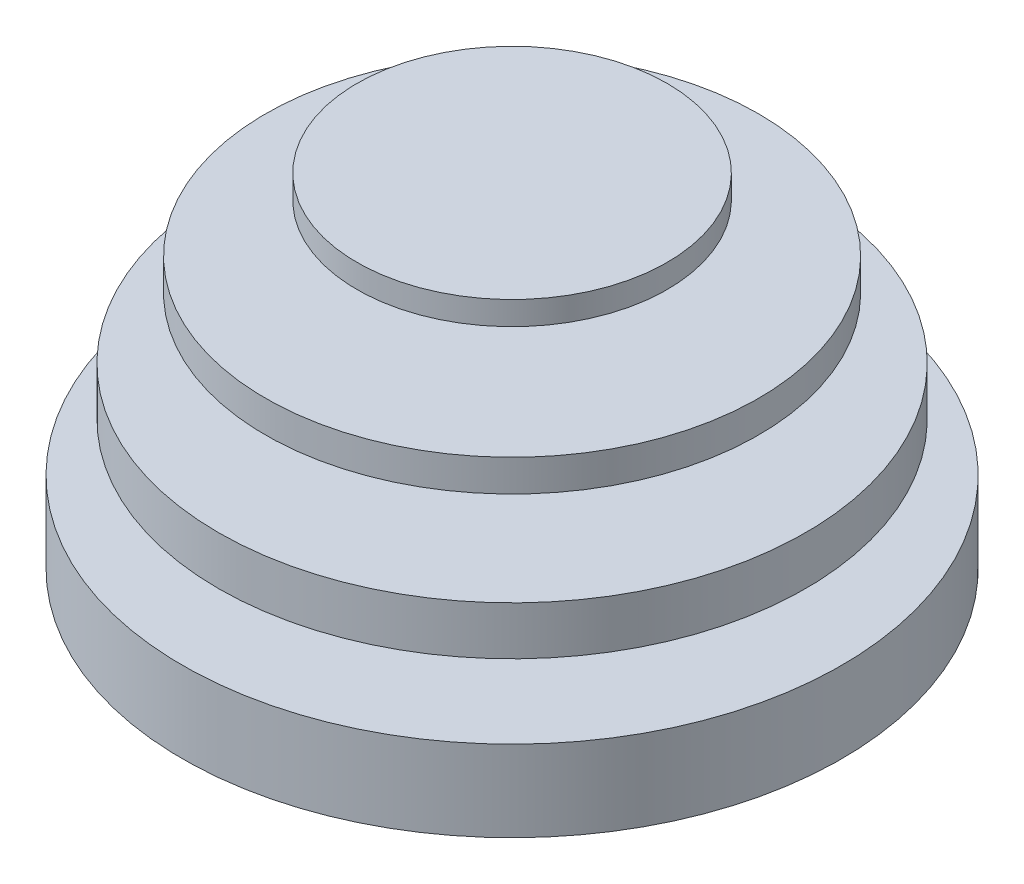
ISO-10303-21;
HEADER;
FILE_DESCRIPTION(('STEP AP214'),'2;1');
FILE_NAME('part.step','',(''),(''),'','','');
FILE_SCHEMA(('AUTOMOTIVE_DESIGN { 1 0 10303 214 1 1 1 1 }'));
ENDSEC;
DATA;
#1=APPLICATION_CONTEXT('core data for automotive mechanical design processes');
#2=APPLICATION_PROTOCOL_DEFINITION('international standard','automotive_design',2000,#1);
#3=PRODUCT_CONTEXT('',#1,'mechanical');
#4=PRODUCT('Part','Part','',(#3));
#5=PRODUCT_RELATED_PRODUCT_CATEGORY('part','',(#4));
#6=PRODUCT_DEFINITION_FORMATION('','',#4);
#7=PRODUCT_DEFINITION_CONTEXT('part definition',#1,'design');
#8=PRODUCT_DEFINITION('design','',#6,#7);
#9=PRODUCT_DEFINITION_SHAPE('','',#8);
#10=(LENGTH_UNIT() NAMED_UNIT(*) SI_UNIT(.MILLI.,.METRE.));
#11=(NAMED_UNIT(*) PLANE_ANGLE_UNIT() SI_UNIT($,.RADIAN.));
#12=(NAMED_UNIT(*) SI_UNIT($,.STERADIAN.) SOLID_ANGLE_UNIT());
#13=UNCERTAINTY_MEASURE_WITH_UNIT(LENGTH_MEASURE(1.E-05),#10,'distance_accuracy_value','');
#14=(GEOMETRIC_REPRESENTATION_CONTEXT(3) GLOBAL_UNCERTAINTY_ASSIGNED_CONTEXT((#13)) GLOBAL_UNIT_ASSIGNED_CONTEXT((#10,
#11,#12)) REPRESENTATION_CONTEXT('',''));
#15=CARTESIAN_POINT('',(0.,0.,0.));
#16=DIRECTION('',(0.,0.,1.));
#17=DIRECTION('',(1.,0.,0.));
#18=AXIS2_PLACEMENT_3D('',#15,#16,#17);
#19=CARTESIAN_POINT('',(0.,67.0732075041318,0.));
#20=DIRECTION('',(0.,1.,0.));
#21=DIRECTION('',(0.,0.,1.));
#22=AXIS2_PLACEMENT_3D('',#19,#20,#21);
#23=PLANE('',#22);
#24=CARTESIAN_POINT('',(0.,67.0732075041318,0.));
#25=DIRECTION('',(0.,-1.,0.));
#26=DIRECTION('',(0.,0.,-1.));
#27=AXIS2_PLACEMENT_3D('',#24,#25,#26);
#28=CIRCLE('',#27,30.3523201634859);
#29=CARTESIAN_POINT('',(0.,67.0732075041318,-30.3523201634859));
#30=VERTEX_POINT('',#29);
#31=EDGE_CURVE('E11',#30,#30,#28,.T.);
#32=ORIENTED_EDGE('',*,*,#31,.F.);
#33=EDGE_LOOP('',(#32));
#34=FACE_BOUND('',#33,.T.);
#35=ADVANCED_FACE('F44',(#34),#23,.T.);
#36=CARTESIAN_POINT('',(0.,25.3387672793387,0.));
#37=DIRECTION('',(0.,-1.,0.));
#38=DIRECTION('',(0.,0.,-1.));
#39=AXIS2_PLACEMENT_3D('',#36,#37,#38);
#40=CYLINDRICAL_SURFACE('',#39,30.3523201634859);
#41=ORIENTED_EDGE('',*,*,#31,.T.);
#42=EDGE_LOOP('',(#41));
#43=FACE_BOUND('',#42,.T.);
#44=CARTESIAN_POINT('',(0.,62.4661589078884,0.));
#45=DIRECTION('',(0.,-1.,0.));
#46=DIRECTION('',(0.,0.,-1.));
#47=AXIS2_PLACEMENT_3D('',#44,#45,#46);
#48=CIRCLE('',#47,30.3523201634859);
#49=CARTESIAN_POINT('',(0.,62.4661589078884,-30.3523201634859));
#50=VERTEX_POINT('',#49);
#51=EDGE_CURVE('E50',#50,#50,#48,.T.);
#52=ORIENTED_EDGE('',*,*,#51,.F.);
#53=EDGE_LOOP('',(#52));
#54=FACE_BOUND('',#53,.T.);
#55=ADVANCED_FACE('F58',(#43,#54),#40,.T.);
#56=CARTESIAN_POINT('',(0.,62.4661589078884,0.));
#57=DIRECTION('',(0.,-1.,0.));
#58=DIRECTION('',(0.,0.,-1.));
#59=AXIS2_PLACEMENT_3D('',#56,#57,#58);
#60=PLANE('',#59);
#61=ORIENTED_EDGE('',*,*,#51,.T.);
#62=EDGE_LOOP('',(#61));
#63=FACE_BOUND('',#62,.T.);
#64=ADVANCED_FACE('F56',(#63),#60,.T.);
#65=CLOSED_SHELL('',(#35,#55,#64));
#66=MANIFOLD_SOLID_BREP('B2',#65);
#67=CARTESIAN_POINT('',(0.,52.9810588567991,0.));
#68=DIRECTION('',(0.,1.,0.));
#69=DIRECTION('',(0.,0.,1.));
#70=AXIS2_PLACEMENT_3D('',#67,#68,#69);
#71=PLANE('',#70);
#72=CARTESIAN_POINT('',(0.,52.9810588567991,0.));
#73=DIRECTION('',(0.,-1.,0.));
#74=DIRECTION('',(0.,0.,-1.));
#75=AXIS2_PLACEMENT_3D('',#72,#73,#74);
#76=CIRCLE('',#75,48.2385088312544);
#77=CARTESIAN_POINT('',(0.,52.9810588567991,-48.2385088312544));
#78=VERTEX_POINT('',#77);
#79=EDGE_CURVE('E43',#78,#78,#76,.T.);
#80=ORIENTED_EDGE('',*,*,#79,.F.);
#81=EDGE_LOOP('',(#80));
#82=FACE_BOUND('',#81,.T.);
#83=ADVANCED_FACE('F93',(#82),#71,.T.);
#84=CARTESIAN_POINT('',(0.,25.3387672793387,0.));
#85=DIRECTION('',(0.,-1.,0.));
#86=DIRECTION('',(0.,0.,-1.));
#87=AXIS2_PLACEMENT_3D('',#84,#85,#86);
#88=CYLINDRICAL_SURFACE('',#87,48.2385088312544);
#89=ORIENTED_EDGE('',*,*,#79,.T.);
#90=EDGE_LOOP('',(#89));
#91=FACE_BOUND('',#90,.T.);
#92=CARTESIAN_POINT('',(0.,46.7479931089404,0.));
#93=DIRECTION('',(0.,-1.,0.));
#94=DIRECTION('',(0.,0.,-1.));
#95=AXIS2_PLACEMENT_3D('',#92,#93,#94);
#96=CIRCLE('',#95,48.2385088312544);
#97=CARTESIAN_POINT('',(0.,46.7479931089404,-48.2385088312544));
#98=VERTEX_POINT('',#97);
#99=EDGE_CURVE('E99',#98,#98,#96,.T.);
#100=ORIENTED_EDGE('',*,*,#99,.F.);
#101=EDGE_LOOP('',(#100));
#102=FACE_BOUND('',#101,.T.);
#103=ADVANCED_FACE('F107',(#91,#102),#88,.T.);
#104=CARTESIAN_POINT('',(0.,46.7479931089404,0.));
#105=DIRECTION('',(0.,-1.,0.));
#106=DIRECTION('',(0.,0.,-1.));
#107=AXIS2_PLACEMENT_3D('',#104,#105,#106);
#108=PLANE('',#107);
#109=ORIENTED_EDGE('',*,*,#99,.T.);
#110=EDGE_LOOP('',(#109));
#111=FACE_BOUND('',#110,.T.);
#112=ADVANCED_FACE('F105',(#111),#108,.T.);
#113=CLOSED_SHELL('',(#83,#103,#112));
#114=MANIFOLD_SOLID_BREP('B6',#113);
#115=CARTESIAN_POINT('',(0.,34.823867330428,0.));
#116=DIRECTION('',(0.,1.,0.));
#117=DIRECTION('',(0.,0.,1.));
#118=AXIS2_PLACEMENT_3D('',#115,#116,#117);
#119=PLANE('',#118);
#120=CARTESIAN_POINT('',(0.,34.823867330428,0.));
#121=DIRECTION('',(0.,-1.,0.));
#122=DIRECTION('',(0.,0.,-1.));
#123=AXIS2_PLACEMENT_3D('',#120,#121,#122);
#124=CIRCLE('',#123,57.4526060237412);
#125=CARTESIAN_POINT('',(0.,34.823867330428,-57.4526060237412));
#126=VERTEX_POINT('',#125);
#127=EDGE_CURVE('E92',#126,#126,#124,.T.);
#128=ORIENTED_EDGE('',*,*,#127,.F.);
#129=EDGE_LOOP('',(#128));
#130=FACE_BOUND('',#129,.T.);
#131=ADVANCED_FACE('F141',(#130),#119,.T.);
#132=CARTESIAN_POINT('',(0.,25.3387672793387,0.));
#133=DIRECTION('',(0.,-1.,0.));
#134=DIRECTION('',(0.,0.,-1.));
#135=AXIS2_PLACEMENT_3D('',#132,#133,#134);
#136=CYLINDRICAL_SURFACE('',#135,57.4526060237412);
#137=ORIENTED_EDGE('',*,*,#127,.T.);
#138=EDGE_LOOP('',(#137));
#139=FACE_BOUND('',#138,.T.);
#140=CARTESIAN_POINT('',(0.,25.3387672793387,0.));
#141=DIRECTION('',(0.,-1.,0.));
#142=DIRECTION('',(0.,0.,-1.));
#143=AXIS2_PLACEMENT_3D('',#140,#141,#142);
#144=CIRCLE('',#143,57.4526060237412);
#145=CARTESIAN_POINT('',(0.,25.3387672793387,-57.4526060237412));
#146=VERTEX_POINT('',#145);
#147=EDGE_CURVE('E147',#146,#146,#144,.T.);
#148=ORIENTED_EDGE('',*,*,#147,.F.);
#149=EDGE_LOOP('',(#148));
#150=FACE_BOUND('',#149,.T.);
#151=ADVANCED_FACE('F155',(#139,#150),#136,.T.);
#152=CARTESIAN_POINT('',(0.,25.3387672793387,0.));
#153=DIRECTION('',(0.,-1.,0.));
#154=DIRECTION('',(0.,0.,-1.));
#155=AXIS2_PLACEMENT_3D('',#152,#153,#154);
#156=PLANE('',#155);
#157=ORIENTED_EDGE('',*,*,#147,.T.);
#158=EDGE_LOOP('',(#157));
#159=FACE_BOUND('',#158,.T.);
#160=ADVANCED_FACE('F153',(#159),#156,.T.);
#161=CLOSED_SHELL('',(#131,#151,#160));
#162=MANIFOLD_SOLID_BREP('B38',#161);
#163=CARTESIAN_POINT('',(0.,15.8536672282493,0.));
#164=DIRECTION('',(0.,1.,0.));
#165=DIRECTION('',(0.,0.,1.));
#166=AXIS2_PLACEMENT_3D('',#163,#164,#165);
#167=PLANE('',#166);
#168=CARTESIAN_POINT('',(0.,15.8536672282493,0.));
#169=DIRECTION('',(0.,-1.,0.));
#170=DIRECTION('',(0.,0.,-1.));
#171=AXIS2_PLACEMENT_3D('',#168,#169,#170);
#172=CIRCLE('',#171,64.4986803474076);
#173=CARTESIAN_POINT('',(0.,15.8536672282493,-64.4986803474076));
#174=VERTEX_POINT('',#173);
#175=EDGE_CURVE('E140',#174,#174,#172,.T.);
#176=ORIENTED_EDGE('',*,*,#175,.F.);
#177=EDGE_LOOP('',(#176));
#178=FACE_BOUND('',#177,.T.);
#179=ADVANCED_FACE('F182',(#178),#167,.T.);
#180=CARTESIAN_POINT('',(0.,25.3387672793387,0.));
#181=DIRECTION('',(0.,-1.,0.));
#182=DIRECTION('',(0.,0.,-1.));
#183=AXIS2_PLACEMENT_3D('',#180,#181,#182);
#184=CYLINDRICAL_SURFACE('',#183,64.4986803474076);
#185=ORIENTED_EDGE('',*,*,#175,.T.);
#186=EDGE_LOOP('',(#185));
#187=FACE_BOUND('',#186,.T.);
#188=CARTESIAN_POINT('',(0.,0.,0.));
#189=DIRECTION('',(0.,-1.,0.));
#190=DIRECTION('',(0.,0.,-1.));
#191=AXIS2_PLACEMENT_3D('',#188,#189,#190);
#192=CIRCLE('',#191,64.4986803474076);
#193=CARTESIAN_POINT('',(0.,0.,-64.4986803474076));
#194=VERTEX_POINT('',#193);
#195=EDGE_CURVE('E188',#194,#194,#192,.T.);
#196=ORIENTED_EDGE('',*,*,#195,.F.);
#197=EDGE_LOOP('',(#196));
#198=FACE_BOUND('',#197,.T.);
#199=ADVANCED_FACE('F196',(#187,#198),#184,.T.);
#200=CARTESIAN_POINT('',(0.,0.,0.));
#201=DIRECTION('',(0.,-1.,0.));
#202=DIRECTION('',(0.,0.,-1.));
#203=AXIS2_PLACEMENT_3D('',#200,#201,#202);
#204=PLANE('',#203);
#205=ORIENTED_EDGE('',*,*,#195,.T.);
#206=EDGE_LOOP('',(#205));
#207=FACE_BOUND('',#206,.T.);
#208=ADVANCED_FACE('F194',(#207),#204,.T.);
#209=CLOSED_SHELL('',(#179,#199,#208));
#210=MANIFOLD_SOLID_BREP('B87',#209);
#211=ADVANCED_BREP_SHAPE_REPRESENTATION('',(#18,#66,#114,#162,#210),#14);
#212=SHAPE_DEFINITION_REPRESENTATION(#9,#211);
ENDSEC;
END-ISO-10303-21;
